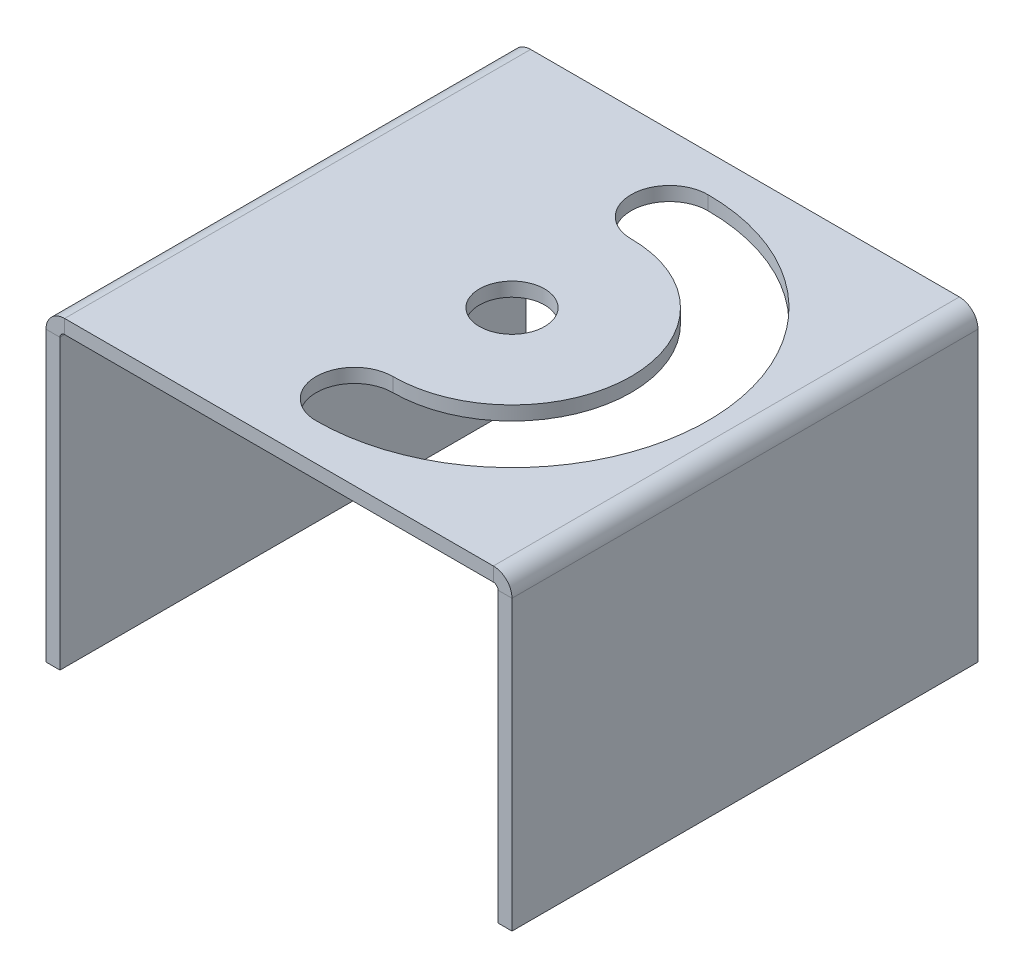
ISO-10303-21;
HEADER;
FILE_DESCRIPTION(('STEP AP214'),'2;1');
FILE_NAME('part.step','',(''),(''),'','','');
FILE_SCHEMA(('AUTOMOTIVE_DESIGN { 1 0 10303 214 1 1 1 1 }'));
ENDSEC;
DATA;
#1=APPLICATION_CONTEXT('core data for automotive mechanical design processes');
#2=APPLICATION_PROTOCOL_DEFINITION('international standard','automotive_design',2000,#1);
#3=PRODUCT_CONTEXT('',#1,'mechanical');
#4=PRODUCT('Part','Part','',(#3));
#5=PRODUCT_RELATED_PRODUCT_CATEGORY('part','',(#4));
#6=PRODUCT_DEFINITION_FORMATION('','',#4);
#7=PRODUCT_DEFINITION_CONTEXT('part definition',#1,'design');
#8=PRODUCT_DEFINITION('design','',#6,#7);
#9=PRODUCT_DEFINITION_SHAPE('','',#8);
#10=(LENGTH_UNIT() NAMED_UNIT(*) SI_UNIT(.MILLI.,.METRE.));
#11=(NAMED_UNIT(*) PLANE_ANGLE_UNIT() SI_UNIT($,.RADIAN.));
#12=(NAMED_UNIT(*) SI_UNIT($,.STERADIAN.) SOLID_ANGLE_UNIT());
#13=UNCERTAINTY_MEASURE_WITH_UNIT(LENGTH_MEASURE(1.E-05),#10,'distance_accuracy_value','');
#14=(GEOMETRIC_REPRESENTATION_CONTEXT(3) GLOBAL_UNCERTAINTY_ASSIGNED_CONTEXT((#13)) GLOBAL_UNIT_ASSIGNED_CONTEXT((#10,
#11,#12)) REPRESENTATION_CONTEXT('',''));
#15=CARTESIAN_POINT('',(0.,0.,0.));
#16=DIRECTION('',(0.,0.,1.));
#17=DIRECTION('',(1.,0.,0.));
#18=AXIS2_PLACEMENT_3D('',#15,#16,#17);
#19=CARTESIAN_POINT('',(-23.,32.930870365987,50.));
#20=DIRECTION('',(0.,1.,0.));
#21=DIRECTION('',(0.,0.,1.));
#22=AXIS2_PLACEMENT_3D('',#19,#20,#21);
#23=PLANE('',#22);
#24=DIRECTION('',(1.,0.,0.));
#25=VECTOR('',#24,1.);
#26=CARTESIAN_POINT('',(-23.,32.930870365987,0.));
#27=LINE('',#26,#25);
#28=CARTESIAN_POINT('',(-23.,32.930870365987,0.));
#29=VERTEX_POINT('',#28);
#30=CARTESIAN_POINT('',(23.,32.930870365987,0.));
#31=VERTEX_POINT('',#30);
#32=EDGE_CURVE('E240',#29,#31,#27,.T.);
#33=ORIENTED_EDGE('',*,*,#32,.F.);
#34=DIRECTION('',(0.,0.,-1.));
#35=VECTOR('',#34,1.);
#36=CARTESIAN_POINT('',(-23.,32.930870365987,50.));
#37=LINE('',#36,#35);
#38=CARTESIAN_POINT('',(-23.,32.930870365987,50.));
#39=VERTEX_POINT('',#38);
#40=EDGE_CURVE('E281',#39,#29,#37,.T.);
#41=ORIENTED_EDGE('',*,*,#40,.F.);
#42=DIRECTION('',(1.,0.,0.));
#43=VECTOR('',#42,1.);
#44=CARTESIAN_POINT('',(-23.,32.930870365987,50.));
#45=LINE('',#44,#43);
#46=CARTESIAN_POINT('',(23.,32.930870365987,50.));
#47=VERTEX_POINT('',#46);
#48=EDGE_CURVE('E203',#39,#47,#45,.T.);
#49=ORIENTED_EDGE('',*,*,#48,.T.);
#50=DIRECTION('',(0.,0.,-1.));
#51=VECTOR('',#50,1.);
#52=CARTESIAN_POINT('',(23.,32.930870365987,50.));
#53=LINE('',#52,#51);
#54=EDGE_CURVE('E284',#47,#31,#53,.T.);
#55=ORIENTED_EDGE('',*,*,#54,.T.);
#56=EDGE_LOOP('',(#33,#41,#49,#55));
#57=FACE_BOUND('',#56,.T.);
#58=CARTESIAN_POINT('',(0.,32.930870365987,25.));
#59=DIRECTION('',(0.,1.,0.));
#60=DIRECTION('',(0.,0.,1.));
#61=AXIS2_PLACEMENT_3D('',#58,#59,#60);
#62=CIRCLE('',#61,3.5);
#63=CARTESIAN_POINT('',(0.,32.930870365987,28.5));
#64=VERTEX_POINT('',#63);
#65=EDGE_CURVE('E185',#64,#64,#62,.T.);
#66=ORIENTED_EDGE('',*,*,#65,.F.);
#67=EDGE_LOOP('',(#66));
#68=FACE_BOUND('',#67,.T.);
#69=CARTESIAN_POINT('',(0.,32.930870365987,8.09884097731022));
#70=DIRECTION('',(0.,1.,0.));
#71=DIRECTION('',(0.,0.,1.));
#72=AXIS2_PLACEMENT_3D('',#69,#70,#71);
#73=CIRCLE('',#72,4.11737914080141);
#74=CARTESIAN_POINT('',(0.,32.930870365987,3.98146183650881));
#75=VERTEX_POINT('',#74);
#76=CARTESIAN_POINT('',(0.,32.930870365987,12.2162201181116));
#77=VERTEX_POINT('',#76);
#78=EDGE_CURVE('E63',#75,#77,#73,.T.);
#79=ORIENTED_EDGE('',*,*,#78,.F.);
#80=CARTESIAN_POINT('',(0.,32.930870365987,25.));
#81=DIRECTION('',(0.,1.,0.));
#82=DIRECTION('',(0.,0.,1.));
#83=AXIS2_PLACEMENT_3D('',#80,#81,#82);
#84=CIRCLE('',#83,21.0185381634912);
#85=CARTESIAN_POINT('',(0.,32.930870365987,46.0185381634912));
#86=VERTEX_POINT('',#85);
#87=EDGE_CURVE('E178',#86,#75,#84,.T.);
#88=ORIENTED_EDGE('',*,*,#87,.F.);
#89=CARTESIAN_POINT('',(0.,32.930870365987,41.9011590226898));
#90=DIRECTION('',(0.,1.,0.));
#91=DIRECTION('',(0.,0.,-1.));
#92=AXIS2_PLACEMENT_3D('',#89,#90,#91);
#93=CIRCLE('',#92,4.11737914080141);
#94=CARTESIAN_POINT('',(0.,32.930870365987,37.7837798818884));
#95=VERTEX_POINT('',#94);
#96=EDGE_CURVE('E164',#95,#86,#93,.T.);
#97=ORIENTED_EDGE('',*,*,#96,.F.);
#98=CARTESIAN_POINT('',(0.,32.930870365987,25.));
#99=DIRECTION('',(0.,-1.,0.));
#100=DIRECTION('',(0.,0.,1.));
#101=AXIS2_PLACEMENT_3D('',#98,#99,#100);
#102=CIRCLE('',#101,12.7837798818884);
#103=EDGE_CURVE('E173',#77,#95,#102,.T.);
#104=ORIENTED_EDGE('',*,*,#103,.F.);
#105=EDGE_LOOP('',(#79,#88,#97,#104));
#106=FACE_BOUND('',#105,.T.);
#107=ADVANCED_FACE('F48',(#57,#68,#106),#23,.T.);
#108=CARTESIAN_POINT('',(-23.,31.430870365987,50.));
#109=DIRECTION('',(0.,1.,0.));
#110=DIRECTION('',(0.,0.,1.));
#111=AXIS2_PLACEMENT_3D('',#108,#109,#110);
#112=PLANE('',#111);
#113=CARTESIAN_POINT('',(0.,31.430870365987,25.));
#114=DIRECTION('',(0.,1.,0.));
#115=DIRECTION('',(0.,0.,1.));
#116=AXIS2_PLACEMENT_3D('',#113,#114,#115);
#117=CIRCLE('',#116,3.5);
#118=CARTESIAN_POINT('',(0.,31.430870365987,28.5));
#119=VERTEX_POINT('',#118);
#120=EDGE_CURVE('E190',#119,#119,#117,.T.);
#121=ORIENTED_EDGE('',*,*,#120,.T.);
#122=EDGE_LOOP('',(#121));
#123=FACE_BOUND('',#122,.T.);
#124=DIRECTION('',(1.,0.,0.));
#125=VECTOR('',#124,1.);
#126=CARTESIAN_POINT('',(-23.,31.430870365987,0.));
#127=LINE('',#126,#125);
#128=CARTESIAN_POINT('',(-23.,31.430870365987,0.));
#129=VERTEX_POINT('',#128);
#130=CARTESIAN_POINT('',(23.,31.430870365987,0.));
#131=VERTEX_POINT('',#130);
#132=EDGE_CURVE('E258',#129,#131,#127,.T.);
#133=ORIENTED_EDGE('',*,*,#132,.T.);
#134=DIRECTION('',(0.,0.,-1.));
#135=VECTOR('',#134,1.);
#136=CARTESIAN_POINT('',(23.,31.430870365987,50.));
#137=LINE('',#136,#135);
#138=CARTESIAN_POINT('',(23.,31.430870365987,50.));
#139=VERTEX_POINT('',#138);
#140=EDGE_CURVE('E265',#139,#131,#137,.T.);
#141=ORIENTED_EDGE('',*,*,#140,.F.);
#142=DIRECTION('',(1.,0.,0.));
#143=VECTOR('',#142,1.);
#144=CARTESIAN_POINT('',(-23.,31.430870365987,50.));
#145=LINE('',#144,#143);
#146=CARTESIAN_POINT('',(-23.,31.430870365987,50.));
#147=VERTEX_POINT('',#146);
#148=EDGE_CURVE('E221',#147,#139,#145,.T.);
#149=ORIENTED_EDGE('',*,*,#148,.F.);
#150=DIRECTION('',(0.,0.,-1.));
#151=VECTOR('',#150,1.);
#152=CARTESIAN_POINT('',(-23.,31.430870365987,50.));
#153=LINE('',#152,#151);
#154=EDGE_CURVE('E268',#147,#129,#153,.T.);
#155=ORIENTED_EDGE('',*,*,#154,.T.);
#156=EDGE_LOOP('',(#133,#141,#149,#155));
#157=FACE_BOUND('',#156,.T.);
#158=CARTESIAN_POINT('',(0.,31.430870365987,25.));
#159=DIRECTION('',(0.,1.,0.));
#160=DIRECTION('',(0.,0.,1.));
#161=AXIS2_PLACEMENT_3D('',#158,#159,#160);
#162=CIRCLE('',#161,21.0185381634912);
#163=CARTESIAN_POINT('',(0.,31.430870365987,46.0185381634912));
#164=VERTEX_POINT('',#163);
#165=CARTESIAN_POINT('',(0.,31.430870365987,3.98146183650881));
#166=VERTEX_POINT('',#165);
#167=EDGE_CURVE('E56',#164,#166,#162,.T.);
#168=ORIENTED_EDGE('',*,*,#167,.T.);
#169=CARTESIAN_POINT('',(0.,31.430870365987,8.09884097731022));
#170=DIRECTION('',(0.,1.,0.));
#171=DIRECTION('',(0.,0.,1.));
#172=AXIS2_PLACEMENT_3D('',#169,#170,#171);
#173=CIRCLE('',#172,4.11737914080141);
#174=CARTESIAN_POINT('',(0.,31.430870365987,12.2162201181116));
#175=VERTEX_POINT('',#174);
#176=EDGE_CURVE('E13',#166,#175,#173,.T.);
#177=ORIENTED_EDGE('',*,*,#176,.T.);
#178=CARTESIAN_POINT('',(0.,31.430870365987,25.));
#179=DIRECTION('',(0.,1.,0.));
#180=DIRECTION('',(0.,0.,1.));
#181=AXIS2_PLACEMENT_3D('',#178,#179,#180);
#182=CIRCLE('',#181,12.7837798818884);
#183=CARTESIAN_POINT('',(0.,31.430870365987,37.7837798818884));
#184=VERTEX_POINT('',#183);
#185=EDGE_CURVE('E310',#175,#184,#182,.F.);
#186=ORIENTED_EDGE('',*,*,#185,.T.);
#187=CARTESIAN_POINT('',(0.,31.430870365987,41.9011590226898));
#188=DIRECTION('',(0.,1.,0.));
#189=DIRECTION('',(0.,0.,1.));
#190=AXIS2_PLACEMENT_3D('',#187,#188,#189);
#191=CIRCLE('',#190,4.11737914080141);
#192=EDGE_CURVE('E167',#184,#164,#191,.T.);
#193=ORIENTED_EDGE('',*,*,#192,.T.);
#194=EDGE_LOOP('',(#168,#177,#186,#193));
#195=FACE_BOUND('',#194,.T.);
#196=ADVANCED_FACE('F316',(#123,#157,#195),#112,.F.);
#197=CARTESIAN_POINT('',(-23.,32.930870365987,50.));
#198=DIRECTION('',(0.,0.,1.));
#199=DIRECTION('',(1.,0.,0.));
#200=AXIS2_PLACEMENT_3D('',#197,#198,#199);
#201=PLANE('',#200);
#202=DIRECTION('',(0.,-1.,0.));
#203=VECTOR('',#202,1.);
#204=CARTESIAN_POINT('',(-23.,32.930870365987,50.));
#205=LINE('',#204,#203);
#206=EDGE_CURVE('E308',#39,#147,#205,.T.);
#207=ORIENTED_EDGE('',*,*,#206,.F.);
#208=CARTESIAN_POINT('',(-23.,30.930870365987,50.));
#209=DIRECTION('',(0.,0.,-1.));
#210=DIRECTION('',(-1.,0.,0.));
#211=AXIS2_PLACEMENT_3D('',#208,#209,#210);
#212=CIRCLE('',#211,2.);
#213=CARTESIAN_POINT('',(-25.,30.930870365987,50.));
#214=VERTEX_POINT('',#213);
#215=EDGE_CURVE('E206',#214,#39,#212,.T.);
#216=ORIENTED_EDGE('',*,*,#215,.F.);
#217=DIRECTION('',(-1.,0.,0.));
#218=VECTOR('',#217,1.);
#219=CARTESIAN_POINT('',(-23.5,30.930870365987,50.));
#220=LINE('',#219,#218);
#221=CARTESIAN_POINT('',(-23.5,30.930870365987,50.));
#222=VERTEX_POINT('',#221);
#223=EDGE_CURVE('E306',#222,#214,#220,.T.);
#224=ORIENTED_EDGE('',*,*,#223,.F.);
#225=CARTESIAN_POINT('',(-23.,30.930870365987,50.));
#226=DIRECTION('',(0.,0.,1.));
#227=DIRECTION('',(1.,0.,0.));
#228=AXIS2_PLACEMENT_3D('',#225,#226,#227);
#229=CIRCLE('',#228,0.500000000000002);
#230=EDGE_CURVE('E218',#222,#147,#229,.F.);
#231=ORIENTED_EDGE('',*,*,#230,.T.);
#232=EDGE_LOOP('',(#207,#216,#224,#231));
#233=FACE_BOUND('',#232,.T.);
#234=ADVANCED_FACE('F50',(#233),#201,.T.);
#235=CARTESIAN_POINT('',(-23.5,30.930870365987,50.));
#236=DIRECTION('',(0.,0.,1.));
#237=DIRECTION('',(1.,0.,0.));
#238=AXIS2_PLACEMENT_3D('',#235,#236,#237);
#239=PLANE('',#238);
#240=ORIENTED_EDGE('',*,*,#48,.F.);
#241=ORIENTED_EDGE('',*,*,#206,.T.);
#242=ORIENTED_EDGE('',*,*,#148,.T.);
#243=DIRECTION('',(0.,1.,0.));
#244=VECTOR('',#243,1.);
#245=CARTESIAN_POINT('',(23.,31.430870365987,50.));
#246=LINE('',#245,#244);
#247=EDGE_CURVE('E298',#139,#47,#246,.T.);
#248=ORIENTED_EDGE('',*,*,#247,.T.);
#249=EDGE_LOOP('',(#240,#241,#242,#248));
#250=FACE_BOUND('',#249,.T.);
#251=ADVANCED_FACE('F385',(#250),#239,.T.);
#252=CARTESIAN_POINT('',(-25.,30.930870365987,0.));
#253=DIRECTION('',(0.,0.,-1.));
#254=DIRECTION('',(-1.,0.,0.));
#255=AXIS2_PLACEMENT_3D('',#252,#253,#254);
#256=PLANE('',#255);
#257=DIRECTION('',(1.,0.,0.));
#258=VECTOR('',#257,1.);
#259=CARTESIAN_POINT('',(-25.,30.930870365987,0.));
#260=LINE('',#259,#258);
#261=CARTESIAN_POINT('',(-25.,30.930870365987,0.));
#262=VERTEX_POINT('',#261);
#263=CARTESIAN_POINT('',(-23.5,30.930870365987,0.));
#264=VERTEX_POINT('',#263);
#265=EDGE_CURVE('E304',#262,#264,#260,.T.);
#266=ORIENTED_EDGE('',*,*,#265,.F.);
#267=CARTESIAN_POINT('',(-23.,30.930870365987,0.));
#268=DIRECTION('',(0.,0.,-1.));
#269=DIRECTION('',(-1.,0.,0.));
#270=AXIS2_PLACEMENT_3D('',#267,#268,#269);
#271=CIRCLE('',#270,2.);
#272=EDGE_CURVE('E243',#262,#29,#271,.T.);
#273=ORIENTED_EDGE('',*,*,#272,.T.);
#274=DIRECTION('',(0.,1.,0.));
#275=VECTOR('',#274,1.);
#276=CARTESIAN_POINT('',(-23.,31.430870365987,0.));
#277=LINE('',#276,#275);
#278=EDGE_CURVE('E302',#129,#29,#277,.T.);
#279=ORIENTED_EDGE('',*,*,#278,.F.);
#280=CARTESIAN_POINT('',(-23.,30.930870365987,0.));
#281=DIRECTION('',(0.,0.,1.));
#282=DIRECTION('',(1.,0.,0.));
#283=AXIS2_PLACEMENT_3D('',#280,#281,#282);
#284=CIRCLE('',#283,0.500000000000002);
#285=EDGE_CURVE('E255',#264,#129,#284,.F.);
#286=ORIENTED_EDGE('',*,*,#285,.F.);
#287=EDGE_LOOP('',(#266,#273,#279,#286));
#288=FACE_BOUND('',#287,.T.);
#289=ADVANCED_FACE('F382',(#288),#256,.T.);
#290=CARTESIAN_POINT('',(-23.,31.430870365987,0.));
#291=DIRECTION('',(0.,0.,-1.));
#292=DIRECTION('',(-1.,0.,0.));
#293=AXIS2_PLACEMENT_3D('',#290,#291,#292);
#294=PLANE('',#293);
#295=DIRECTION('',(0.,1.,0.));
#296=VECTOR('',#295,1.);
#297=CARTESIAN_POINT('',(-25.,0.,0.));
#298=LINE('',#297,#296);
#299=CARTESIAN_POINT('',(-25.,0.,0.));
#300=VERTEX_POINT('',#299);
#301=EDGE_CURVE('E246',#300,#262,#298,.T.);
#302=ORIENTED_EDGE('',*,*,#301,.T.);
#303=ORIENTED_EDGE('',*,*,#265,.T.);
#304=DIRECTION('',(0.,1.,0.));
#305=VECTOR('',#304,1.);
#306=CARTESIAN_POINT('',(-23.5,0.,0.));
#307=LINE('',#306,#305);
#308=CARTESIAN_POINT('',(-23.5,0.,0.));
#309=VERTEX_POINT('',#308);
#310=EDGE_CURVE('E252',#309,#264,#307,.T.);
#311=ORIENTED_EDGE('',*,*,#310,.F.);
#312=DIRECTION('',(-1.,0.,0.));
#313=VECTOR('',#312,1.);
#314=CARTESIAN_POINT('',(-23.5,0.,0.));
#315=LINE('',#314,#313);
#316=EDGE_CURVE('E249',#309,#300,#315,.T.);
#317=ORIENTED_EDGE('',*,*,#316,.T.);
#318=EDGE_LOOP('',(#302,#303,#311,#317));
#319=FACE_BOUND('',#318,.T.);
#320=ADVANCED_FACE('F378',(#319),#294,.T.);
#321=CARTESIAN_POINT('',(25.,30.930870365987,50.));
#322=DIRECTION('',(0.,0.,1.));
#323=DIRECTION('',(1.,0.,0.));
#324=AXIS2_PLACEMENT_3D('',#321,#322,#323);
#325=PLANE('',#324);
#326=DIRECTION('',(-1.,0.,0.));
#327=VECTOR('',#326,1.);
#328=CARTESIAN_POINT('',(25.,30.930870365987,50.));
#329=LINE('',#328,#327);
#330=CARTESIAN_POINT('',(25.,30.930870365987,50.));
#331=VERTEX_POINT('',#330);
#332=CARTESIAN_POINT('',(23.5,30.930870365987,50.));
#333=VERTEX_POINT('',#332);
#334=EDGE_CURVE('E300',#331,#333,#329,.T.);
#335=ORIENTED_EDGE('',*,*,#334,.F.);
#336=CARTESIAN_POINT('',(23.,30.930870365987,50.));
#337=DIRECTION('',(0.,0.,-1.));
#338=DIRECTION('',(-1.,0.,0.));
#339=AXIS2_PLACEMENT_3D('',#336,#337,#338);
#340=CIRCLE('',#339,2.);
#341=EDGE_CURVE('E200',#47,#331,#340,.T.);
#342=ORIENTED_EDGE('',*,*,#341,.F.);
#343=ORIENTED_EDGE('',*,*,#247,.F.);
#344=CARTESIAN_POINT('',(23.,30.930870365987,50.));
#345=DIRECTION('',(0.,0.,1.));
#346=DIRECTION('',(1.,0.,0.));
#347=AXIS2_PLACEMENT_3D('',#344,#345,#346);
#348=CIRCLE('',#347,0.500000000000002);
#349=EDGE_CURVE('E224',#139,#333,#348,.F.);
#350=ORIENTED_EDGE('',*,*,#349,.T.);
#351=EDGE_LOOP('',(#335,#342,#343,#350));
#352=FACE_BOUND('',#351,.T.);
#353=ADVANCED_FACE('F374',(#352),#325,.T.);
#354=CARTESIAN_POINT('',(23.,31.430870365987,50.));
#355=DIRECTION('',(0.,0.,1.));
#356=DIRECTION('',(1.,0.,0.));
#357=AXIS2_PLACEMENT_3D('',#354,#355,#356);
#358=PLANE('',#357);
#359=DIRECTION('',(0.,-1.,0.));
#360=VECTOR('',#359,1.);
#361=CARTESIAN_POINT('',(25.,30.930870365987,50.));
#362=LINE('',#361,#360);
#363=CARTESIAN_POINT('',(25.,0.,50.));
#364=VERTEX_POINT('',#363);
#365=EDGE_CURVE('E197',#331,#364,#362,.T.);
#366=ORIENTED_EDGE('',*,*,#365,.F.);
#367=ORIENTED_EDGE('',*,*,#334,.T.);
#368=DIRECTION('',(0.,1.,0.));
#369=VECTOR('',#368,1.);
#370=CARTESIAN_POINT('',(23.5,30.930870365987,50.));
#371=LINE('',#370,#369);
#372=CARTESIAN_POINT('',(23.5,0.,50.));
#373=VERTEX_POINT('',#372);
#374=EDGE_CURVE('E191',#333,#373,#371,.F.);
#375=ORIENTED_EDGE('',*,*,#374,.T.);
#376=DIRECTION('',(-1.,0.,0.));
#377=VECTOR('',#376,1.);
#378=CARTESIAN_POINT('',(25.,0.,50.));
#379=LINE('',#378,#377);
#380=EDGE_CURVE('E193',#364,#373,#379,.T.);
#381=ORIENTED_EDGE('',*,*,#380,.F.);
#382=EDGE_LOOP('',(#366,#367,#375,#381));
#383=FACE_BOUND('',#382,.T.);
#384=ADVANCED_FACE('F370',(#383),#358,.T.);
#385=CARTESIAN_POINT('',(23.,32.930870365987,0.));
#386=DIRECTION('',(0.,0.,-1.));
#387=DIRECTION('',(-1.,0.,0.));
#388=AXIS2_PLACEMENT_3D('',#385,#386,#387);
#389=PLANE('',#388);
#390=DIRECTION('',(0.,-1.,0.));
#391=VECTOR('',#390,1.);
#392=CARTESIAN_POINT('',(23.,32.930870365987,0.));
#393=LINE('',#392,#391);
#394=EDGE_CURVE('E296',#31,#131,#393,.T.);
#395=ORIENTED_EDGE('',*,*,#394,.F.);
#396=CARTESIAN_POINT('',(23.,30.930870365987,0.));
#397=DIRECTION('',(0.,0.,-1.));
#398=DIRECTION('',(-1.,0.,0.));
#399=AXIS2_PLACEMENT_3D('',#396,#397,#398);
#400=CIRCLE('',#399,2.);
#401=CARTESIAN_POINT('',(25.,30.930870365987,0.));
#402=VERTEX_POINT('',#401);
#403=EDGE_CURVE('E237',#31,#402,#400,.T.);
#404=ORIENTED_EDGE('',*,*,#403,.T.);
#405=DIRECTION('',(1.,0.,0.));
#406=VECTOR('',#405,1.);
#407=CARTESIAN_POINT('',(23.5,30.930870365987,0.));
#408=LINE('',#407,#406);
#409=CARTESIAN_POINT('',(23.5,30.930870365987,0.));
#410=VERTEX_POINT('',#409);
#411=EDGE_CURVE('E294',#410,#402,#408,.T.);
#412=ORIENTED_EDGE('',*,*,#411,.F.);
#413=CARTESIAN_POINT('',(23.,30.930870365987,0.));
#414=DIRECTION('',(0.,0.,1.));
#415=DIRECTION('',(1.,0.,0.));
#416=AXIS2_PLACEMENT_3D('',#413,#414,#415);
#417=CIRCLE('',#416,0.500000000000002);
#418=EDGE_CURVE('E194',#131,#410,#417,.F.);
#419=ORIENTED_EDGE('',*,*,#418,.F.);
#420=EDGE_LOOP('',(#395,#404,#412,#419));
#421=FACE_BOUND('',#420,.T.);
#422=ADVANCED_FACE('F366',(#421),#389,.T.);
#423=CARTESIAN_POINT('',(23.5,30.930870365987,0.));
#424=DIRECTION('',(0.,0.,-1.));
#425=DIRECTION('',(-1.,0.,0.));
#426=AXIS2_PLACEMENT_3D('',#423,#424,#425);
#427=PLANE('',#426);
#428=ORIENTED_EDGE('',*,*,#32,.T.);
#429=ORIENTED_EDGE('',*,*,#394,.T.);
#430=ORIENTED_EDGE('',*,*,#132,.F.);
#431=ORIENTED_EDGE('',*,*,#278,.T.);
#432=EDGE_LOOP('',(#428,#429,#430,#431));
#433=FACE_BOUND('',#432,.T.);
#434=ADVANCED_FACE('F362',(#433),#427,.T.);
#435=CARTESIAN_POINT('',(23.5,30.930870365987,50.));
#436=DIRECTION('',(1.,0.,0.));
#437=DIRECTION('',(0.,0.,-1.));
#438=AXIS2_PLACEMENT_3D('',#435,#436,#437);
#439=PLANE('',#438);
#440=DIRECTION('',(0.,1.,0.));
#441=VECTOR('',#440,1.);
#442=CARTESIAN_POINT('',(23.5,30.930870365987,0.));
#443=LINE('',#442,#441);
#444=CARTESIAN_POINT('',(23.5,0.,0.));
#445=VERTEX_POINT('',#444);
#446=EDGE_CURVE('E228',#410,#445,#443,.F.);
#447=ORIENTED_EDGE('',*,*,#446,.T.);
#448=DIRECTION('',(0.,0.,-1.));
#449=VECTOR('',#448,1.);
#450=CARTESIAN_POINT('',(23.5,0.,50.));
#451=LINE('',#450,#449);
#452=EDGE_CURVE('E292',#373,#445,#451,.T.);
#453=ORIENTED_EDGE('',*,*,#452,.F.);
#454=ORIENTED_EDGE('',*,*,#374,.F.);
#455=DIRECTION('',(0.,0.,-1.));
#456=VECTOR('',#455,1.);
#457=CARTESIAN_POINT('',(23.5,30.930870365987,50.));
#458=LINE('',#457,#456);
#459=EDGE_CURVE('E227',#333,#410,#458,.T.);
#460=ORIENTED_EDGE('',*,*,#459,.T.);
#461=EDGE_LOOP('',(#447,#453,#454,#460));
#462=FACE_BOUND('',#461,.T.);
#463=ADVANCED_FACE('F358',(#462),#439,.F.);
#464=CARTESIAN_POINT('',(25.,0.,50.));
#465=DIRECTION('',(0.,-1.,0.));
#466=DIRECTION('',(0.,0.,-1.));
#467=AXIS2_PLACEMENT_3D('',#464,#465,#466);
#468=PLANE('',#467);
#469=DIRECTION('',(-1.,0.,0.));
#470=VECTOR('',#469,1.);
#471=CARTESIAN_POINT('',(25.,0.,0.));
#472=LINE('',#471,#470);
#473=CARTESIAN_POINT('',(25.,0.,0.));
#474=VERTEX_POINT('',#473);
#475=EDGE_CURVE('E231',#474,#445,#472,.T.);
#476=ORIENTED_EDGE('',*,*,#475,.F.);
#477=DIRECTION('',(0.,0.,-1.));
#478=VECTOR('',#477,1.);
#479=CARTESIAN_POINT('',(25.,0.,50.));
#480=LINE('',#479,#478);
#481=EDGE_CURVE('E290',#364,#474,#480,.T.);
#482=ORIENTED_EDGE('',*,*,#481,.F.);
#483=ORIENTED_EDGE('',*,*,#380,.T.);
#484=ORIENTED_EDGE('',*,*,#452,.T.);
#485=EDGE_LOOP('',(#476,#482,#483,#484));
#486=FACE_BOUND('',#485,.T.);
#487=ADVANCED_FACE('F354',(#486),#468,.T.);
#488=CARTESIAN_POINT('',(25.,30.930870365987,50.));
#489=DIRECTION('',(1.,0.,0.));
#490=DIRECTION('',(0.,0.,-1.));
#491=AXIS2_PLACEMENT_3D('',#488,#489,#490);
#492=PLANE('',#491);
#493=DIRECTION('',(0.,-1.,0.));
#494=VECTOR('',#493,1.);
#495=CARTESIAN_POINT('',(25.,30.930870365987,0.));
#496=LINE('',#495,#494);
#497=EDGE_CURVE('E234',#402,#474,#496,.T.);
#498=ORIENTED_EDGE('',*,*,#497,.F.);
#499=DIRECTION('',(0.,0.,-1.));
#500=VECTOR('',#499,1.);
#501=CARTESIAN_POINT('',(25.,30.930870365987,50.));
#502=LINE('',#501,#500);
#503=EDGE_CURVE('E287',#331,#402,#502,.T.);
#504=ORIENTED_EDGE('',*,*,#503,.F.);
#505=ORIENTED_EDGE('',*,*,#365,.T.);
#506=ORIENTED_EDGE('',*,*,#481,.T.);
#507=EDGE_LOOP('',(#498,#504,#505,#506));
#508=FACE_BOUND('',#507,.T.);
#509=ADVANCED_FACE('F350',(#508),#492,.T.);
#510=CARTESIAN_POINT('',(23.,30.930870365987,50.));
#511=DIRECTION('',(0.,0.,-1.));
#512=DIRECTION('',(-1.,0.,0.));
#513=AXIS2_PLACEMENT_3D('',#510,#511,#512);
#514=CYLINDRICAL_SURFACE('',#513,2.);
#515=ORIENTED_EDGE('',*,*,#403,.F.);
#516=ORIENTED_EDGE('',*,*,#54,.F.);
#517=ORIENTED_EDGE('',*,*,#341,.T.);
#518=ORIENTED_EDGE('',*,*,#503,.T.);
#519=EDGE_LOOP('',(#515,#516,#517,#518));
#520=FACE_BOUND('',#519,.T.);
#521=ADVANCED_FACE('F347',(#520),#514,.T.);
#522=CARTESIAN_POINT('',(-23.,30.930870365987,50.));
#523=DIRECTION('',(0.,0.,-1.));
#524=DIRECTION('',(-1.,0.,0.));
#525=AXIS2_PLACEMENT_3D('',#522,#523,#524);
#526=CYLINDRICAL_SURFACE('',#525,2.);
#527=ORIENTED_EDGE('',*,*,#272,.F.);
#528=DIRECTION('',(0.,0.,-1.));
#529=VECTOR('',#528,1.);
#530=CARTESIAN_POINT('',(-25.,30.930870365987,50.));
#531=LINE('',#530,#529);
#532=EDGE_CURVE('E278',#214,#262,#531,.T.);
#533=ORIENTED_EDGE('',*,*,#532,.F.);
#534=ORIENTED_EDGE('',*,*,#215,.T.);
#535=ORIENTED_EDGE('',*,*,#40,.T.);
#536=EDGE_LOOP('',(#527,#533,#534,#535));
#537=FACE_BOUND('',#536,.T.);
#538=ADVANCED_FACE('F345',(#537),#526,.T.);
#539=CARTESIAN_POINT('',(-25.,0.,50.));
#540=DIRECTION('',(-1.,0.,0.));
#541=DIRECTION('',(0.,0.,1.));
#542=AXIS2_PLACEMENT_3D('',#539,#540,#541);
#543=PLANE('',#542);
#544=ORIENTED_EDGE('',*,*,#301,.F.);
#545=DIRECTION('',(0.,0.,-1.));
#546=VECTOR('',#545,1.);
#547=CARTESIAN_POINT('',(-25.,0.,50.));
#548=LINE('',#547,#546);
#549=CARTESIAN_POINT('',(-25.,0.,50.));
#550=VERTEX_POINT('',#549);
#551=EDGE_CURVE('E276',#550,#300,#548,.T.);
#552=ORIENTED_EDGE('',*,*,#551,.F.);
#553=DIRECTION('',(0.,1.,0.));
#554=VECTOR('',#553,1.);
#555=CARTESIAN_POINT('',(-25.,0.,50.));
#556=LINE('',#555,#554);
#557=EDGE_CURVE('E209',#550,#214,#556,.T.);
#558=ORIENTED_EDGE('',*,*,#557,.T.);
#559=ORIENTED_EDGE('',*,*,#532,.T.);
#560=EDGE_LOOP('',(#544,#552,#558,#559));
#561=FACE_BOUND('',#560,.T.);
#562=ADVANCED_FACE('F403',(#561),#543,.T.);
#563=CARTESIAN_POINT('',(-23.5,0.,50.));
#564=DIRECTION('',(0.,-1.,0.));
#565=DIRECTION('',(0.,0.,-1.));
#566=AXIS2_PLACEMENT_3D('',#563,#564,#565);
#567=PLANE('',#566);
#568=ORIENTED_EDGE('',*,*,#316,.F.);
#569=DIRECTION('',(0.,0.,-1.));
#570=VECTOR('',#569,1.);
#571=CARTESIAN_POINT('',(-23.5,0.,50.));
#572=LINE('',#571,#570);
#573=CARTESIAN_POINT('',(-23.5,0.,50.));
#574=VERTEX_POINT('',#573);
#575=EDGE_CURVE('E274',#574,#309,#572,.T.);
#576=ORIENTED_EDGE('',*,*,#575,.F.);
#577=DIRECTION('',(-1.,0.,0.));
#578=VECTOR('',#577,1.);
#579=CARTESIAN_POINT('',(-23.5,0.,50.));
#580=LINE('',#579,#578);
#581=EDGE_CURVE('E212',#574,#550,#580,.T.);
#582=ORIENTED_EDGE('',*,*,#581,.T.);
#583=ORIENTED_EDGE('',*,*,#551,.T.);
#584=EDGE_LOOP('',(#568,#576,#582,#583));
#585=FACE_BOUND('',#584,.T.);
#586=ADVANCED_FACE('F409',(#585),#567,.T.);
#587=CARTESIAN_POINT('',(-23.5,0.,50.));
#588=DIRECTION('',(-1.,0.,0.));
#589=DIRECTION('',(0.,0.,1.));
#590=AXIS2_PLACEMENT_3D('',#587,#588,#589);
#591=PLANE('',#590);
#592=ORIENTED_EDGE('',*,*,#310,.T.);
#593=DIRECTION('',(0.,0.,-1.));
#594=VECTOR('',#593,1.);
#595=CARTESIAN_POINT('',(-23.5,30.930870365987,50.));
#596=LINE('',#595,#594);
#597=EDGE_CURVE('E271',#222,#264,#596,.T.);
#598=ORIENTED_EDGE('',*,*,#597,.F.);
#599=DIRECTION('',(0.,1.,0.));
#600=VECTOR('',#599,1.);
#601=CARTESIAN_POINT('',(-23.5,0.,50.));
#602=LINE('',#601,#600);
#603=EDGE_CURVE('E215',#574,#222,#602,.T.);
#604=ORIENTED_EDGE('',*,*,#603,.F.);
#605=ORIENTED_EDGE('',*,*,#575,.T.);
#606=EDGE_LOOP('',(#592,#598,#604,#605));
#607=FACE_BOUND('',#606,.T.);
#608=ADVANCED_FACE('F414',(#607),#591,.F.);
#609=CARTESIAN_POINT('',(-23.,30.930870365987,50.));
#610=DIRECTION('',(0.,0.,-1.));
#611=DIRECTION('',(-1.,0.,0.));
#612=AXIS2_PLACEMENT_3D('',#609,#610,#611);
#613=CYLINDRICAL_SURFACE('',#612,0.500000000000002);
#614=ORIENTED_EDGE('',*,*,#285,.T.);
#615=ORIENTED_EDGE('',*,*,#154,.F.);
#616=ORIENTED_EDGE('',*,*,#230,.F.);
#617=ORIENTED_EDGE('',*,*,#597,.T.);
#618=EDGE_LOOP('',(#614,#615,#616,#617));
#619=FACE_BOUND('',#618,.T.);
#620=ADVANCED_FACE('F419',(#619),#613,.F.);
#621=CARTESIAN_POINT('',(23.,30.930870365987,50.));
#622=DIRECTION('',(0.,0.,-1.));
#623=DIRECTION('',(-1.,0.,0.));
#624=AXIS2_PLACEMENT_3D('',#621,#622,#623);
#625=CYLINDRICAL_SURFACE('',#624,0.500000000000002);
#626=ORIENTED_EDGE('',*,*,#418,.T.);
#627=ORIENTED_EDGE('',*,*,#459,.F.);
#628=ORIENTED_EDGE('',*,*,#349,.F.);
#629=ORIENTED_EDGE('',*,*,#140,.T.);
#630=EDGE_LOOP('',(#626,#627,#628,#629));
#631=FACE_BOUND('',#630,.T.);
#632=ADVANCED_FACE('F428',(#631),#625,.F.);
#633=CARTESIAN_POINT('',(23.,30.930870365987,50.));
#634=DIRECTION('',(0.,0.,-1.));
#635=DIRECTION('',(-1.,0.,0.));
#636=AXIS2_PLACEMENT_3D('',#633,#634,#635);
#637=PLANE('',#636);
#638=ORIENTED_EDGE('',*,*,#603,.T.);
#639=ORIENTED_EDGE('',*,*,#223,.T.);
#640=ORIENTED_EDGE('',*,*,#557,.F.);
#641=ORIENTED_EDGE('',*,*,#581,.F.);
#642=EDGE_LOOP('',(#638,#639,#640,#641));
#643=FACE_BOUND('',#642,.T.);
#644=ADVANCED_FACE('F406',(#643),#637,.F.);
#645=CARTESIAN_POINT('',(23.,30.930870365987,0.));
#646=DIRECTION('',(0.,0.,-1.));
#647=DIRECTION('',(-1.,0.,0.));
#648=AXIS2_PLACEMENT_3D('',#645,#646,#647);
#649=PLANE('',#648);
#650=ORIENTED_EDGE('',*,*,#446,.F.);
#651=ORIENTED_EDGE('',*,*,#411,.T.);
#652=ORIENTED_EDGE('',*,*,#497,.T.);
#653=ORIENTED_EDGE('',*,*,#475,.T.);
#654=EDGE_LOOP('',(#650,#651,#652,#653));
#655=FACE_BOUND('',#654,.T.);
#656=ADVANCED_FACE('F329',(#655),#649,.T.);
#657=CARTESIAN_POINT('',(0.,22.930870365987,25.));
#658=DIRECTION('',(0.,1.,0.));
#659=DIRECTION('',(0.,0.,1.));
#660=AXIS2_PLACEMENT_3D('',#657,#658,#659);
#661=CYLINDRICAL_SURFACE('',#660,3.5);
#662=ORIENTED_EDGE('',*,*,#65,.T.);
#663=EDGE_LOOP('',(#662));
#664=FACE_BOUND('',#663,.T.);
#665=ORIENTED_EDGE('',*,*,#120,.F.);
#666=EDGE_LOOP('',(#665));
#667=FACE_BOUND('',#666,.T.);
#668=ADVANCED_FACE('F322',(#664,#667),#661,.F.);
#669=CARTESIAN_POINT('',(0.,29.930870365987,8.09884097731022));
#670=DIRECTION('',(0.,1.,0.));
#671=DIRECTION('',(0.,0.,1.));
#672=AXIS2_PLACEMENT_3D('',#669,#670,#671);
#673=CYLINDRICAL_SURFACE('',#672,4.11737914080141);
#674=DIRECTION('',(0.,1.,0.));
#675=VECTOR('',#674,1.);
#676=CARTESIAN_POINT('',(0.,29.930870365987,3.98146183650881));
#677=LINE('',#676,#675);
#678=EDGE_CURVE('E183',#166,#75,#677,.T.);
#679=ORIENTED_EDGE('',*,*,#678,.T.);
#680=ORIENTED_EDGE('',*,*,#78,.T.);
#681=DIRECTION('',(0.,1.,0.));
#682=VECTOR('',#681,1.);
#683=CARTESIAN_POINT('',(0.,29.930870365987,12.2162201181116));
#684=LINE('',#683,#682);
#685=EDGE_CURVE('E170',#175,#77,#684,.T.);
#686=ORIENTED_EDGE('',*,*,#685,.F.);
#687=ORIENTED_EDGE('',*,*,#176,.F.);
#688=EDGE_LOOP('',(#679,#680,#686,#687));
#689=FACE_BOUND('',#688,.T.);
#690=ADVANCED_FACE('F320',(#689),#673,.F.);
#691=CARTESIAN_POINT('',(0.,29.930870365987,25.));
#692=DIRECTION('',(0.,1.,0.));
#693=DIRECTION('',(0.,0.,1.));
#694=AXIS2_PLACEMENT_3D('',#691,#692,#693);
#695=CYLINDRICAL_SURFACE('',#694,21.0185381634912);
#696=DIRECTION('',(0.,1.,0.));
#697=VECTOR('',#696,1.);
#698=CARTESIAN_POINT('',(0.,29.930870365987,46.0185381634912));
#699=LINE('',#698,#697);
#700=EDGE_CURVE('E169',#164,#86,#699,.T.);
#701=ORIENTED_EDGE('',*,*,#700,.T.);
#702=ORIENTED_EDGE('',*,*,#87,.T.);
#703=ORIENTED_EDGE('',*,*,#678,.F.);
#704=ORIENTED_EDGE('',*,*,#167,.F.);
#705=EDGE_LOOP('',(#701,#702,#703,#704));
#706=FACE_BOUND('',#705,.T.);
#707=ADVANCED_FACE('F319',(#706),#695,.F.);
#708=CARTESIAN_POINT('',(0.,29.930870365987,41.9011590226898));
#709=DIRECTION('',(0.,1.,0.));
#710=DIRECTION('',(0.,0.,1.));
#711=AXIS2_PLACEMENT_3D('',#708,#709,#710);
#712=CYLINDRICAL_SURFACE('',#711,4.11737914080141);
#713=DIRECTION('',(0.,1.,0.));
#714=VECTOR('',#713,1.);
#715=CARTESIAN_POINT('',(0.,29.930870365987,37.7837798818884));
#716=LINE('',#715,#714);
#717=EDGE_CURVE('E71',#184,#95,#716,.T.);
#718=ORIENTED_EDGE('',*,*,#717,.T.);
#719=ORIENTED_EDGE('',*,*,#96,.T.);
#720=ORIENTED_EDGE('',*,*,#700,.F.);
#721=ORIENTED_EDGE('',*,*,#192,.F.);
#722=EDGE_LOOP('',(#718,#719,#720,#721));
#723=FACE_BOUND('',#722,.T.);
#724=ADVANCED_FACE('F161',(#723),#712,.F.);
#725=CARTESIAN_POINT('',(0.,29.930870365987,25.));
#726=DIRECTION('',(0.,1.,0.));
#727=DIRECTION('',(0.,0.,1.));
#728=AXIS2_PLACEMENT_3D('',#725,#726,#727);
#729=CYLINDRICAL_SURFACE('',#728,12.7837798818884);
#730=ORIENTED_EDGE('',*,*,#685,.T.);
#731=ORIENTED_EDGE('',*,*,#103,.T.);
#732=ORIENTED_EDGE('',*,*,#717,.F.);
#733=ORIENTED_EDGE('',*,*,#185,.F.);
#734=EDGE_LOOP('',(#730,#731,#732,#733));
#735=FACE_BOUND('',#734,.T.);
#736=ADVANCED_FACE('F174',(#735),#729,.T.);
#737=CLOSED_SHELL('',(#107,#196,#234,#251,#289,#320,#353,#384,#422,#434,#463,#487,#509,#521,
#538,#562,#586,#608,#620,#632,#644,#656,#668,#690,#707,#724,#736));
#738=MANIFOLD_SOLID_BREP('B2',#737);
#739=ADVANCED_BREP_SHAPE_REPRESENTATION('',(#18,#738),#14);
#740=SHAPE_DEFINITION_REPRESENTATION(#9,#739);
ENDSEC;
END-ISO-10303-21;
